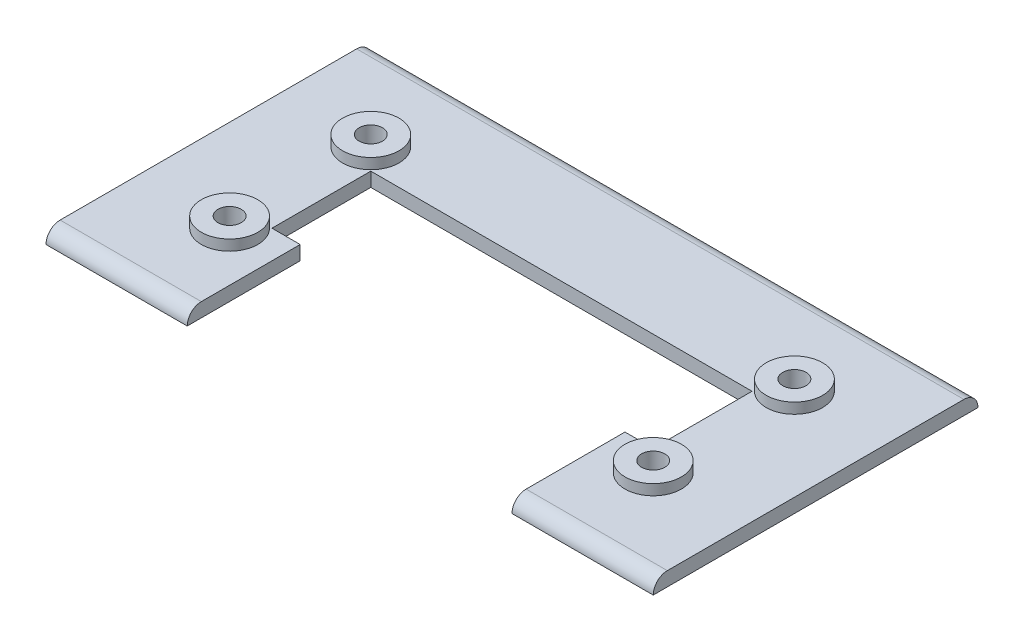
ISO-10303-21;
HEADER;
FILE_DESCRIPTION(('STEP AP214'),'2;1');
FILE_NAME('part.step','',(''),(''),'','','');
FILE_SCHEMA(('AUTOMOTIVE_DESIGN { 1 0 10303 214 1 1 1 1 }'));
ENDSEC;
DATA;
#1=APPLICATION_CONTEXT('core data for automotive mechanical design processes');
#2=APPLICATION_PROTOCOL_DEFINITION('international standard','automotive_design',2000,#1);
#3=PRODUCT_CONTEXT('',#1,'mechanical');
#4=PRODUCT('Part','Part','',(#3));
#5=PRODUCT_RELATED_PRODUCT_CATEGORY('part','',(#4));
#6=PRODUCT_DEFINITION_FORMATION('','',#4);
#7=PRODUCT_DEFINITION_CONTEXT('part definition',#1,'design');
#8=PRODUCT_DEFINITION('design','',#6,#7);
#9=PRODUCT_DEFINITION_SHAPE('','',#8);
#10=(LENGTH_UNIT() NAMED_UNIT(*) SI_UNIT(.MILLI.,.METRE.));
#11=(NAMED_UNIT(*) PLANE_ANGLE_UNIT() SI_UNIT($,.RADIAN.));
#12=(NAMED_UNIT(*) SI_UNIT($,.STERADIAN.) SOLID_ANGLE_UNIT());
#13=UNCERTAINTY_MEASURE_WITH_UNIT(LENGTH_MEASURE(1.E-05),#10,'distance_accuracy_value','');
#14=(GEOMETRIC_REPRESENTATION_CONTEXT(3) GLOBAL_UNCERTAINTY_ASSIGNED_CONTEXT((#13)) GLOBAL_UNIT_ASSIGNED_CONTEXT((#10,
#11,#12)) REPRESENTATION_CONTEXT('',''));
#15=CARTESIAN_POINT('',(0.,0.,0.));
#16=DIRECTION('',(0.,0.,1.));
#17=DIRECTION('',(1.,0.,0.));
#18=AXIS2_PLACEMENT_3D('',#15,#16,#17);
#19=CARTESIAN_POINT('',(0.,0.,21.));
#20=DIRECTION('',(-1.,0.,0.));
#21=DIRECTION('',(0.,0.,1.));
#22=AXIS2_PLACEMENT_3D('',#19,#20,#21);
#23=CYLINDRICAL_SURFACE('',#22,2.);
#24=CARTESIAN_POINT('',(-23.,0.,21.));
#25=DIRECTION('',(-1.,0.,0.));
#26=DIRECTION('',(0.,0.,1.));
#27=AXIS2_PLACEMENT_3D('',#24,#25,#26);
#28=CIRCLE('',#27,2.);
#29=CARTESIAN_POINT('',(-23.,2.,21.));
#30=VERTEX_POINT('',#29);
#31=CARTESIAN_POINT('',(-23.,0.,23.));
#32=VERTEX_POINT('',#31);
#33=EDGE_CURVE('E222',#30,#32,#28,.F.);
#34=ORIENTED_EDGE('',*,*,#33,.F.);
#35=DIRECTION('',(1.,0.,0.));
#36=VECTOR('',#35,1.);
#37=CARTESIAN_POINT('',(0.,2.,21.));
#38=LINE('',#37,#36);
#39=CARTESIAN_POINT('',(-43.,2.,21.));
#40=VERTEX_POINT('',#39);
#41=EDGE_CURVE('E380',#40,#30,#38,.T.);
#42=ORIENTED_EDGE('',*,*,#41,.F.);
#43=CARTESIAN_POINT('',(-43.,0.,21.));
#44=DIRECTION('',(1.,0.,0.));
#45=DIRECTION('',(0.,0.,-1.));
#46=AXIS2_PLACEMENT_3D('',#43,#44,#45);
#47=CIRCLE('',#46,2.);
#48=CARTESIAN_POINT('',(-43.,0.,23.));
#49=VERTEX_POINT('',#48);
#50=EDGE_CURVE('E383',#49,#40,#47,.F.);
#51=ORIENTED_EDGE('',*,*,#50,.F.);
#52=DIRECTION('',(1.,0.,0.));
#53=VECTOR('',#52,1.);
#54=CARTESIAN_POINT('',(43.,0.,23.));
#55=LINE('',#54,#53);
#56=EDGE_CURVE('E364',#49,#32,#55,.T.);
#57=ORIENTED_EDGE('',*,*,#56,.T.);
#58=EDGE_LOOP('',(#34,#42,#51,#57));
#59=FACE_BOUND('',#58,.T.);
#60=ADVANCED_FACE('F35',(#59),#23,.T.);
#61=CARTESIAN_POINT('',(27.,0.,7.));
#62=DIRECTION('',(0.,0.,1.));
#63=DIRECTION('',(1.,0.,0.));
#64=AXIS2_PLACEMENT_3D('',#61,#62,#63);
#65=PLANE('',#64);
#66=DIRECTION('',(1.,0.,0.));
#67=VECTOR('',#66,1.);
#68=CARTESIAN_POINT('',(27.,2.,7.));
#69=LINE('',#68,#67);
#70=CARTESIAN_POINT('',(-27.,2.,7.));
#71=VERTEX_POINT('',#70);
#72=CARTESIAN_POINT('',(-23.,2.,7.));
#73=VERTEX_POINT('',#72);
#74=EDGE_CURVE('E336',#71,#73,#69,.T.);
#75=ORIENTED_EDGE('',*,*,#74,.T.);
#76=DIRECTION('',(0.,1.,0.));
#77=VECTOR('',#76,1.);
#78=CARTESIAN_POINT('',(-23.,-8.,7.));
#79=LINE('',#78,#77);
#80=CARTESIAN_POINT('',(-23.,0.,7.));
#81=VERTEX_POINT('',#80);
#82=EDGE_CURVE('E212',#81,#73,#79,.T.);
#83=ORIENTED_EDGE('',*,*,#82,.F.);
#84=DIRECTION('',(1.,0.,0.));
#85=VECTOR('',#84,1.);
#86=CARTESIAN_POINT('',(27.,0.,7.));
#87=LINE('',#86,#85);
#88=CARTESIAN_POINT('',(-27.,0.,7.));
#89=VERTEX_POINT('',#88);
#90=EDGE_CURVE('E324',#89,#81,#87,.T.);
#91=ORIENTED_EDGE('',*,*,#90,.F.);
#92=DIRECTION('',(0.,1.,0.));
#93=VECTOR('',#92,1.);
#94=CARTESIAN_POINT('',(-27.,0.,7.));
#95=LINE('',#94,#93);
#96=EDGE_CURVE('E333',#89,#71,#95,.T.);
#97=ORIENTED_EDGE('',*,*,#96,.T.);
#98=EDGE_LOOP('',(#75,#83,#91,#97));
#99=FACE_BOUND('',#98,.T.);
#100=ADVANCED_FACE('F415',(#99),#65,.F.);
#101=CARTESIAN_POINT('',(-37.,0.,17.));
#102=DIRECTION('',(0.,0.707106781186549,0.707106781186546));
#103=DIRECTION('',(0.,-0.707106781186546,0.707106781186549));
#104=AXIS2_PLACEMENT_3D('',#101,#102,#103);
#105=PLANE('',#104);
#106=DIRECTION('',(1.,0.,0.));
#107=VECTOR('',#106,1.);
#108=CARTESIAN_POINT('',(-35.,0.999999999999996,16.));
#109=LINE('',#108,#107);
#110=CARTESIAN_POINT('',(-24.5,0.999999999999996,16.));
#111=VERTEX_POINT('',#110);
#112=CARTESIAN_POINT('',(-36.,0.999999999999996,16.));
#113=VERTEX_POINT('',#112);
#114=EDGE_CURVE('E194',#111,#113,#109,.F.);
#115=ORIENTED_EDGE('',*,*,#114,.F.);
#116=DIRECTION('',(0.,-0.707106781186546,0.707106781186549));
#117=VECTOR('',#116,1.);
#118=CARTESIAN_POINT('',(-24.5,0.,17.));
#119=LINE('',#118,#117);
#120=CARTESIAN_POINT('',(-24.5,0.,17.));
#121=VERTEX_POINT('',#120);
#122=EDGE_CURVE('E192',#111,#121,#119,.T.);
#123=ORIENTED_EDGE('',*,*,#122,.T.);
#124=DIRECTION('',(-1.,0.,0.));
#125=VECTOR('',#124,1.);
#126=CARTESIAN_POINT('',(-37.,0.,17.));
#127=LINE('',#126,#125);
#128=CARTESIAN_POINT('',(-37.,0.,17.));
#129=VERTEX_POINT('',#128);
#130=EDGE_CURVE('E176',#121,#129,#127,.T.);
#131=ORIENTED_EDGE('',*,*,#130,.T.);
#132=DIRECTION('',(-0.577350269189627,-0.577350269189624,0.577350269189627));
#133=VECTOR('',#132,1.);
#134=CARTESIAN_POINT('',(-37.,0.,17.));
#135=LINE('',#134,#133);
#136=EDGE_CURVE('E255',#113,#129,#135,.T.);
#137=ORIENTED_EDGE('',*,*,#136,.F.);
#138=EDGE_LOOP('',(#115,#123,#131,#137));
#139=FACE_BOUND('',#138,.T.);
#140=ADVANCED_FACE('F193',(#139),#105,.F.);
#141=CARTESIAN_POINT('',(-35.,0.,15.));
#142=DIRECTION('',(0.,0.707106781186549,-0.707106781186546));
#143=DIRECTION('',(0.,0.707106781186546,0.707106781186549));
#144=AXIS2_PLACEMENT_3D('',#141,#142,#143);
#145=PLANE('',#144);
#146=DIRECTION('',(0.,0.707106781186546,0.707106781186549));
#147=VECTOR('',#146,1.);
#148=CARTESIAN_POINT('',(-24.5,0.,15.));
#149=LINE('',#148,#147);
#150=CARTESIAN_POINT('',(-24.5,0.,15.));
#151=VERTEX_POINT('',#150);
#152=EDGE_CURVE('E50',#111,#151,#149,.F.);
#153=ORIENTED_EDGE('',*,*,#152,.F.);
#154=ORIENTED_EDGE('',*,*,#114,.T.);
#155=DIRECTION('',(0.577350269189627,-0.577350269189624,-0.577350269189627));
#156=VECTOR('',#155,1.);
#157=CARTESIAN_POINT('',(-35.,0.,15.));
#158=LINE('',#157,#156);
#159=CARTESIAN_POINT('',(-35.,0.,15.));
#160=VERTEX_POINT('',#159);
#161=EDGE_CURVE('E248',#113,#160,#158,.T.);
#162=ORIENTED_EDGE('',*,*,#161,.T.);
#163=DIRECTION('',(-1.,0.,0.));
#164=VECTOR('',#163,1.);
#165=CARTESIAN_POINT('',(-35.,0.,15.));
#166=LINE('',#165,#164);
#167=EDGE_CURVE('E55',#151,#160,#166,.T.);
#168=ORIENTED_EDGE('',*,*,#167,.F.);
#169=EDGE_LOOP('',(#153,#154,#162,#168));
#170=FACE_BOUND('',#169,.T.);
#171=ADVANCED_FACE('F458',(#170),#145,.F.);
#172=CARTESIAN_POINT('',(23.,0.,21.));
#173=DIRECTION('',(1.,0.,0.));
#174=DIRECTION('',(0.,0.,-1.));
#175=AXIS2_PLACEMENT_3D('',#172,#173,#174);
#176=CIRCLE('',#175,2.);
#177=CARTESIAN_POINT('',(23.,0.,23.));
#178=VERTEX_POINT('',#177);
#179=CARTESIAN_POINT('',(23.,2.,21.));
#180=VERTEX_POINT('',#179);
#181=EDGE_CURVE('E218',#178,#180,#176,.F.);
#182=ORIENTED_EDGE('',*,*,#181,.F.);
#183=CARTESIAN_POINT('',(43.,0.,23.));
#184=VERTEX_POINT('',#183);
#185=EDGE_CURVE('E363',#178,#184,#55,.T.);
#186=ORIENTED_EDGE('',*,*,#185,.T.);
#187=CARTESIAN_POINT('',(43.,0.,21.));
#188=DIRECTION('',(-1.,0.,0.));
#189=DIRECTION('',(0.,0.,1.));
#190=AXIS2_PLACEMENT_3D('',#187,#188,#189);
#191=CIRCLE('',#190,2.);
#192=CARTESIAN_POINT('',(43.,2.,21.));
#193=VERTEX_POINT('',#192);
#194=EDGE_CURVE('E43',#193,#184,#191,.F.);
#195=ORIENTED_EDGE('',*,*,#194,.F.);
#196=EDGE_CURVE('E379',#180,#193,#38,.T.);
#197=ORIENTED_EDGE('',*,*,#196,.F.);
#198=EDGE_LOOP('',(#182,#186,#195,#197));
#199=FACE_BOUND('',#198,.T.);
#200=ADVANCED_FACE('F37',(#199),#23,.T.);
#201=CARTESIAN_POINT('',(43.,0.,-21.));
#202=DIRECTION('',(-1.,0.,0.));
#203=DIRECTION('',(0.,0.,1.));
#204=AXIS2_PLACEMENT_3D('',#201,#202,#203);
#205=CYLINDRICAL_SURFACE('',#204,2.);
#206=DIRECTION('',(-1.,0.,0.));
#207=VECTOR('',#206,1.);
#208=CARTESIAN_POINT('',(43.,0.,-23.));
#209=LINE('',#208,#207);
#210=CARTESIAN_POINT('',(43.,0.,-23.));
#211=VERTEX_POINT('',#210);
#212=CARTESIAN_POINT('',(-43.,0.,-23.));
#213=VERTEX_POINT('',#212);
#214=EDGE_CURVE('E358',#211,#213,#209,.T.);
#215=ORIENTED_EDGE('',*,*,#214,.T.);
#216=CARTESIAN_POINT('',(-43.,0.,-21.));
#217=DIRECTION('',(1.,0.,0.));
#218=DIRECTION('',(0.,0.,-1.));
#219=AXIS2_PLACEMENT_3D('',#216,#217,#218);
#220=CIRCLE('',#219,2.);
#221=CARTESIAN_POINT('',(-43.,2.,-21.));
#222=VERTEX_POINT('',#221);
#223=EDGE_CURVE('E374',#222,#213,#220,.F.);
#224=ORIENTED_EDGE('',*,*,#223,.F.);
#225=DIRECTION('',(1.,0.,0.));
#226=VECTOR('',#225,1.);
#227=CARTESIAN_POINT('',(43.,2.,-21.));
#228=LINE('',#227,#226);
#229=CARTESIAN_POINT('',(43.,2.,-21.));
#230=VERTEX_POINT('',#229);
#231=EDGE_CURVE('E360',#230,#222,#228,.F.);
#232=ORIENTED_EDGE('',*,*,#231,.F.);
#233=CARTESIAN_POINT('',(43.,0.,-21.));
#234=DIRECTION('',(-1.,0.,0.));
#235=DIRECTION('',(0.,0.,1.));
#236=AXIS2_PLACEMENT_3D('',#233,#234,#235);
#237=CIRCLE('',#236,2.);
#238=EDGE_CURVE('E376',#211,#230,#237,.F.);
#239=ORIENTED_EDGE('',*,*,#238,.F.);
#240=EDGE_LOOP('',(#215,#224,#232,#239));
#241=FACE_BOUND('',#240,.T.);
#242=ADVANCED_FACE('F398',(#241),#205,.T.);
#243=CARTESIAN_POINT('',(0.,2.,0.));
#244=DIRECTION('',(0.,1.,0.));
#245=DIRECTION('',(0.,0.,1.));
#246=AXIS2_PLACEMENT_3D('',#243,#244,#245);
#247=PLANE('',#246);
#248=ORIENTED_EDGE('',*,*,#41,.T.);
#249=DIRECTION('',(0.,0.,1.));
#250=VECTOR('',#249,1.);
#251=CARTESIAN_POINT('',(-23.,2.,7.));
#252=LINE('',#251,#250);
#253=EDGE_CURVE('E207',#73,#30,#252,.T.);
#254=ORIENTED_EDGE('',*,*,#253,.F.);
#255=ORIENTED_EDGE('',*,*,#74,.F.);
#256=DIRECTION('',(0.,0.,1.));
#257=VECTOR('',#256,1.);
#258=CARTESIAN_POINT('',(-27.,2.,7.));
#259=LINE('',#258,#257);
#260=CARTESIAN_POINT('',(-27.,2.,-7.));
#261=VERTEX_POINT('',#260);
#262=EDGE_CURVE('E316',#261,#71,#259,.T.);
#263=ORIENTED_EDGE('',*,*,#262,.F.);
#264=DIRECTION('',(-1.,0.,0.));
#265=VECTOR('',#264,1.);
#266=CARTESIAN_POINT('',(27.,2.,-7.));
#267=LINE('',#266,#265);
#268=CARTESIAN_POINT('',(27.,2.,-7.));
#269=VERTEX_POINT('',#268);
#270=EDGE_CURVE('E323',#269,#261,#267,.T.);
#271=ORIENTED_EDGE('',*,*,#270,.F.);
#272=DIRECTION('',(0.,0.,-1.));
#273=VECTOR('',#272,1.);
#274=CARTESIAN_POINT('',(27.,2.,7.));
#275=LINE('',#274,#273);
#276=CARTESIAN_POINT('',(27.,2.,7.));
#277=VERTEX_POINT('',#276);
#278=EDGE_CURVE('E339',#277,#269,#275,.T.);
#279=ORIENTED_EDGE('',*,*,#278,.F.);
#280=CARTESIAN_POINT('',(23.,2.,7.));
#281=VERTEX_POINT('',#280);
#282=EDGE_CURVE('E335',#281,#277,#69,.T.);
#283=ORIENTED_EDGE('',*,*,#282,.F.);
#284=DIRECTION('',(0.,0.,-1.));
#285=VECTOR('',#284,1.);
#286=CARTESIAN_POINT('',(23.,2.,7.));
#287=LINE('',#286,#285);
#288=EDGE_CURVE('E209',#180,#281,#287,.T.);
#289=ORIENTED_EDGE('',*,*,#288,.F.);
#290=ORIENTED_EDGE('',*,*,#196,.T.);
#291=DIRECTION('',(0.,0.,-1.));
#292=VECTOR('',#291,1.);
#293=CARTESIAN_POINT('',(43.,2.,23.));
#294=LINE('',#293,#292);
#295=EDGE_CURVE('E357',#193,#230,#294,.T.);
#296=ORIENTED_EDGE('',*,*,#295,.T.);
#297=ORIENTED_EDGE('',*,*,#231,.T.);
#298=DIRECTION('',(0.,0.,1.));
#299=VECTOR('',#298,1.);
#300=CARTESIAN_POINT('',(-43.,2.,23.));
#301=LINE('',#300,#299);
#302=EDGE_CURVE('E354',#222,#40,#301,.T.);
#303=ORIENTED_EDGE('',*,*,#302,.T.);
#304=EDGE_LOOP('',(#248,#254,#255,#263,#271,#279,#283,#289,#290,#296,#297,#303));
#305=FACE_BOUND('',#304,.T.);
#306=CARTESIAN_POINT('',(30.,2.,10.));
#307=DIRECTION('',(0.,1.,0.));
#308=DIRECTION('',(0.,0.,1.));
#309=AXIS2_PLACEMENT_3D('',#306,#307,#308);
#310=CIRCLE('',#309,4.00000000000001);
#311=CARTESIAN_POINT('',(30.,2.,14.));
#312=VERTEX_POINT('',#311);
#313=EDGE_CURVE('E298',#312,#312,#310,.T.);
#314=ORIENTED_EDGE('',*,*,#313,.F.);
#315=EDGE_LOOP('',(#314));
#316=FACE_BOUND('',#315,.T.);
#317=CARTESIAN_POINT('',(-30.,2.,-10.));
#318=DIRECTION('',(0.,1.,0.));
#319=DIRECTION('',(0.,0.,1.));
#320=AXIS2_PLACEMENT_3D('',#317,#318,#319);
#321=CIRCLE('',#320,4.);
#322=CARTESIAN_POINT('',(-30.,2.,-6.));
#323=VERTEX_POINT('',#322);
#324=EDGE_CURVE('E310',#323,#323,#321,.T.);
#325=ORIENTED_EDGE('',*,*,#324,.F.);
#326=EDGE_LOOP('',(#325));
#327=FACE_BOUND('',#326,.T.);
#328=CARTESIAN_POINT('',(-30.,2.,10.));
#329=DIRECTION('',(0.,1.,0.));
#330=DIRECTION('',(0.,0.,-1.));
#331=AXIS2_PLACEMENT_3D('',#328,#329,#330);
#332=CIRCLE('',#331,4.00000000000001);
#333=CARTESIAN_POINT('',(-30.,2.,6.00000000000001));
#334=VERTEX_POINT('',#333);
#335=EDGE_CURVE('E304',#334,#334,#332,.T.);
#336=ORIENTED_EDGE('',*,*,#335,.F.);
#337=EDGE_LOOP('',(#336));
#338=FACE_BOUND('',#337,.T.);
#339=CARTESIAN_POINT('',(30.,2.,-10.));
#340=DIRECTION('',(0.,1.,0.));
#341=DIRECTION('',(0.,0.,-1.));
#342=AXIS2_PLACEMENT_3D('',#339,#340,#341);
#343=CIRCLE('',#342,4.00000000000001);
#344=CARTESIAN_POINT('',(30.,2.,-14.));
#345=VERTEX_POINT('',#344);
#346=EDGE_CURVE('E294',#345,#345,#343,.T.);
#347=ORIENTED_EDGE('',*,*,#346,.F.);
#348=EDGE_LOOP('',(#347));
#349=FACE_BOUND('',#348,.T.);
#350=ADVANCED_FACE('F402',(#305,#316,#327,#338,#349),#247,.T.);
#351=CARTESIAN_POINT('',(-43.,2.,23.));
#352=DIRECTION('',(1.,0.,0.));
#353=DIRECTION('',(0.,0.,-1.));
#354=AXIS2_PLACEMENT_3D('',#351,#352,#353);
#355=PLANE('',#354);
#356=DIRECTION('',(0.,0.,1.));
#357=VECTOR('',#356,1.);
#358=CARTESIAN_POINT('',(-43.,0.,23.));
#359=LINE('',#358,#357);
#360=EDGE_CURVE('E346',#213,#49,#359,.T.);
#361=ORIENTED_EDGE('',*,*,#360,.T.);
#362=ORIENTED_EDGE('',*,*,#50,.T.);
#363=ORIENTED_EDGE('',*,*,#302,.F.);
#364=ORIENTED_EDGE('',*,*,#223,.T.);
#365=EDGE_LOOP('',(#361,#362,#363,#364));
#366=FACE_BOUND('',#365,.T.);
#367=ADVANCED_FACE('F405',(#366),#355,.F.);
#368=CARTESIAN_POINT('',(43.,2.,23.));
#369=DIRECTION('',(-1.,0.,0.));
#370=DIRECTION('',(0.,0.,1.));
#371=AXIS2_PLACEMENT_3D('',#368,#369,#370);
#372=PLANE('',#371);
#373=ORIENTED_EDGE('',*,*,#295,.F.);
#374=ORIENTED_EDGE('',*,*,#194,.T.);
#375=DIRECTION('',(0.,0.,-1.));
#376=VECTOR('',#375,1.);
#377=CARTESIAN_POINT('',(43.,0.,23.));
#378=LINE('',#377,#376);
#379=EDGE_CURVE('E367',#184,#211,#378,.T.);
#380=ORIENTED_EDGE('',*,*,#379,.T.);
#381=ORIENTED_EDGE('',*,*,#238,.T.);
#382=EDGE_LOOP('',(#373,#374,#380,#381));
#383=FACE_BOUND('',#382,.T.);
#384=ADVANCED_FACE('F389',(#383),#372,.F.);
#385=CARTESIAN_POINT('',(0.,0.,0.));
#386=DIRECTION('',(0.,1.,0.));
#387=DIRECTION('',(0.,0.,1.));
#388=AXIS2_PLACEMENT_3D('',#385,#386,#387);
#389=PLANE('',#388);
#390=DIRECTION('',(0.,0.,-1.));
#391=VECTOR('',#390,1.);
#392=CARTESIAN_POINT('',(-24.5,0.,15.));
#393=LINE('',#392,#391);
#394=EDGE_CURVE('E181',#121,#151,#393,.T.);
#395=ORIENTED_EDGE('',*,*,#394,.T.);
#396=ORIENTED_EDGE('',*,*,#167,.T.);
#397=DIRECTION('',(0.,0.,-1.));
#398=VECTOR('',#397,1.);
#399=CARTESIAN_POINT('',(-35.,0.,-15.));
#400=LINE('',#399,#398);
#401=CARTESIAN_POINT('',(-35.,0.,-15.));
#402=VERTEX_POINT('',#401);
#403=EDGE_CURVE('E234',#160,#402,#400,.T.);
#404=ORIENTED_EDGE('',*,*,#403,.T.);
#405=DIRECTION('',(1.,0.,0.));
#406=VECTOR('',#405,1.);
#407=CARTESIAN_POINT('',(35.,0.,-15.));
#408=LINE('',#407,#406);
#409=CARTESIAN_POINT('',(35.,0.,-15.));
#410=VERTEX_POINT('',#409);
#411=EDGE_CURVE('E225',#402,#410,#408,.T.);
#412=ORIENTED_EDGE('',*,*,#411,.T.);
#413=DIRECTION('',(0.,0.,1.));
#414=VECTOR('',#413,1.);
#415=CARTESIAN_POINT('',(35.,0.,15.));
#416=LINE('',#415,#414);
#417=CARTESIAN_POINT('',(35.,0.,15.));
#418=VERTEX_POINT('',#417);
#419=EDGE_CURVE('E228',#410,#418,#416,.T.);
#420=ORIENTED_EDGE('',*,*,#419,.T.);
#421=CARTESIAN_POINT('',(24.5,0.,15.));
#422=VERTEX_POINT('',#421);
#423=EDGE_CURVE('E231',#418,#422,#166,.T.);
#424=ORIENTED_EDGE('',*,*,#423,.T.);
#425=DIRECTION('',(0.,0.,1.));
#426=VECTOR('',#425,1.);
#427=CARTESIAN_POINT('',(24.5,0.,15.));
#428=LINE('',#427,#426);
#429=CARTESIAN_POINT('',(24.5,0.,17.));
#430=VERTEX_POINT('',#429);
#431=EDGE_CURVE('E196',#422,#430,#428,.T.);
#432=ORIENTED_EDGE('',*,*,#431,.T.);
#433=CARTESIAN_POINT('',(37.,0.,17.));
#434=VERTEX_POINT('',#433);
#435=EDGE_CURVE('E188',#434,#430,#127,.T.);
#436=ORIENTED_EDGE('',*,*,#435,.F.);
#437=DIRECTION('',(0.,0.,1.));
#438=VECTOR('',#437,1.);
#439=CARTESIAN_POINT('',(37.,0.,17.));
#440=LINE('',#439,#438);
#441=CARTESIAN_POINT('',(37.,0.,-17.));
#442=VERTEX_POINT('',#441);
#443=EDGE_CURVE('E189',#442,#434,#440,.T.);
#444=ORIENTED_EDGE('',*,*,#443,.F.);
#445=DIRECTION('',(1.,0.,0.));
#446=VECTOR('',#445,1.);
#447=CARTESIAN_POINT('',(37.,0.,-17.));
#448=LINE('',#447,#446);
#449=CARTESIAN_POINT('',(-37.,0.,-17.));
#450=VERTEX_POINT('',#449);
#451=EDGE_CURVE('E238',#450,#442,#448,.T.);
#452=ORIENTED_EDGE('',*,*,#451,.F.);
#453=DIRECTION('',(0.,0.,-1.));
#454=VECTOR('',#453,1.);
#455=CARTESIAN_POINT('',(-37.,0.,-17.));
#456=LINE('',#455,#454);
#457=EDGE_CURVE('E184',#129,#450,#456,.T.);
#458=ORIENTED_EDGE('',*,*,#457,.F.);
#459=ORIENTED_EDGE('',*,*,#130,.F.);
#460=EDGE_LOOP('',(#395,#396,#404,#412,#420,#424,#432,#436,#444,#452,#458,#459));
#461=FACE_BOUND('',#460,.T.);
#462=DIRECTION('',(0.,0.,1.));
#463=VECTOR('',#462,1.);
#464=CARTESIAN_POINT('',(-23.,0.,0.));
#465=LINE('',#464,#463);
#466=EDGE_CURVE('E220',#81,#32,#465,.T.);
#467=ORIENTED_EDGE('',*,*,#466,.T.);
#468=ORIENTED_EDGE('',*,*,#56,.F.);
#469=ORIENTED_EDGE('',*,*,#360,.F.);
#470=ORIENTED_EDGE('',*,*,#214,.F.);
#471=ORIENTED_EDGE('',*,*,#379,.F.);
#472=ORIENTED_EDGE('',*,*,#185,.F.);
#473=DIRECTION('',(0.,0.,-1.));
#474=VECTOR('',#473,1.);
#475=CARTESIAN_POINT('',(23.,0.,0.));
#476=LINE('',#475,#474);
#477=CARTESIAN_POINT('',(23.,0.,7.));
#478=VERTEX_POINT('',#477);
#479=EDGE_CURVE('E214',#178,#478,#476,.T.);
#480=ORIENTED_EDGE('',*,*,#479,.T.);
#481=CARTESIAN_POINT('',(27.,0.,7.));
#482=VERTEX_POINT('',#481);
#483=EDGE_CURVE('E322',#478,#482,#87,.T.);
#484=ORIENTED_EDGE('',*,*,#483,.T.);
#485=DIRECTION('',(0.,0.,-1.));
#486=VECTOR('',#485,1.);
#487=CARTESIAN_POINT('',(27.,0.,7.));
#488=LINE('',#487,#486);
#489=CARTESIAN_POINT('',(27.,0.,-7.));
#490=VERTEX_POINT('',#489);
#491=EDGE_CURVE('E327',#482,#490,#488,.T.);
#492=ORIENTED_EDGE('',*,*,#491,.T.);
#493=DIRECTION('',(-1.,0.,0.));
#494=VECTOR('',#493,1.);
#495=CARTESIAN_POINT('',(27.,0.,-7.));
#496=LINE('',#495,#494);
#497=CARTESIAN_POINT('',(-27.,0.,-7.));
#498=VERTEX_POINT('',#497);
#499=EDGE_CURVE('E330',#490,#498,#496,.T.);
#500=ORIENTED_EDGE('',*,*,#499,.T.);
#501=DIRECTION('',(0.,0.,1.));
#502=VECTOR('',#501,1.);
#503=CARTESIAN_POINT('',(-27.,0.,7.));
#504=LINE('',#503,#502);
#505=EDGE_CURVE('E319',#498,#89,#504,.T.);
#506=ORIENTED_EDGE('',*,*,#505,.T.);
#507=ORIENTED_EDGE('',*,*,#90,.T.);
#508=EDGE_LOOP('',(#467,#468,#469,#470,#471,#472,#480,#484,#492,#500,#506,#507));
#509=FACE_BOUND('',#508,.T.);
#510=CARTESIAN_POINT('',(-30.,0.,-10.));
#511=DIRECTION('',(0.,1.,0.));
#512=DIRECTION('',(0.,0.,1.));
#513=AXIS2_PLACEMENT_3D('',#510,#511,#512);
#514=CIRCLE('',#513,1.65);
#515=CARTESIAN_POINT('',(-30.,0.,-8.35000000000001));
#516=VERTEX_POINT('',#515);
#517=EDGE_CURVE('E291',#516,#516,#514,.T.);
#518=ORIENTED_EDGE('',*,*,#517,.T.);
#519=EDGE_LOOP('',(#518));
#520=FACE_BOUND('',#519,.T.);
#521=CARTESIAN_POINT('',(30.,0.,-10.));
#522=DIRECTION('',(0.,1.,0.));
#523=DIRECTION('',(0.,0.,1.));
#524=AXIS2_PLACEMENT_3D('',#521,#522,#523);
#525=CIRCLE('',#524,1.65);
#526=CARTESIAN_POINT('',(30.,0.,-8.35000000000002));
#527=VERTEX_POINT('',#526);
#528=EDGE_CURVE('E285',#527,#527,#525,.T.);
#529=ORIENTED_EDGE('',*,*,#528,.T.);
#530=EDGE_LOOP('',(#529));
#531=FACE_BOUND('',#530,.T.);
#532=CARTESIAN_POINT('',(30.,0.,10.));
#533=DIRECTION('',(0.,1.,0.));
#534=DIRECTION('',(0.,0.,1.));
#535=AXIS2_PLACEMENT_3D('',#532,#533,#534);
#536=CIRCLE('',#535,1.65);
#537=CARTESIAN_POINT('',(30.,0.,11.65));
#538=VERTEX_POINT('',#537);
#539=EDGE_CURVE('E279',#538,#538,#536,.T.);
#540=ORIENTED_EDGE('',*,*,#539,.T.);
#541=EDGE_LOOP('',(#540));
#542=FACE_BOUND('',#541,.T.);
#543=CARTESIAN_POINT('',(-30.,0.,10.));
#544=DIRECTION('',(0.,1.,0.));
#545=DIRECTION('',(0.,0.,1.));
#546=AXIS2_PLACEMENT_3D('',#543,#544,#545);
#547=CIRCLE('',#546,1.65);
#548=CARTESIAN_POINT('',(-30.,0.,11.65));
#549=VERTEX_POINT('',#548);
#550=EDGE_CURVE('E273',#549,#549,#547,.T.);
#551=ORIENTED_EDGE('',*,*,#550,.T.);
#552=EDGE_LOOP('',(#551));
#553=FACE_BOUND('',#552,.T.);
#554=ADVANCED_FACE('F178',(#461,#509,#520,#531,#542,#553),#389,.F.);
#555=CARTESIAN_POINT('',(-27.,0.,7.));
#556=DIRECTION('',(-1.,0.,0.));
#557=DIRECTION('',(0.,0.,1.));
#558=AXIS2_PLACEMENT_3D('',#555,#556,#557);
#559=PLANE('',#558);
#560=ORIENTED_EDGE('',*,*,#262,.T.);
#561=ORIENTED_EDGE('',*,*,#96,.F.);
#562=ORIENTED_EDGE('',*,*,#505,.F.);
#563=DIRECTION('',(0.,1.,0.));
#564=VECTOR('',#563,1.);
#565=CARTESIAN_POINT('',(-27.,0.,-7.));
#566=LINE('',#565,#564);
#567=EDGE_CURVE('E344',#498,#261,#566,.T.);
#568=ORIENTED_EDGE('',*,*,#567,.T.);
#569=EDGE_LOOP('',(#560,#561,#562,#568));
#570=FACE_BOUND('',#569,.T.);
#571=ADVANCED_FACE('F419',(#570),#559,.F.);
#572=CARTESIAN_POINT('',(27.,0.,-7.));
#573=DIRECTION('',(0.,0.,-1.));
#574=DIRECTION('',(-1.,0.,0.));
#575=AXIS2_PLACEMENT_3D('',#572,#573,#574);
#576=PLANE('',#575);
#577=ORIENTED_EDGE('',*,*,#270,.T.);
#578=ORIENTED_EDGE('',*,*,#567,.F.);
#579=ORIENTED_EDGE('',*,*,#499,.F.);
#580=DIRECTION('',(0.,1.,0.));
#581=VECTOR('',#580,1.);
#582=CARTESIAN_POINT('',(27.,0.,-7.));
#583=LINE('',#582,#581);
#584=EDGE_CURVE('E347',#490,#269,#583,.T.);
#585=ORIENTED_EDGE('',*,*,#584,.T.);
#586=EDGE_LOOP('',(#577,#578,#579,#585));
#587=FACE_BOUND('',#586,.T.);
#588=ADVANCED_FACE('F424',(#587),#576,.F.);
#589=CARTESIAN_POINT('',(27.,0.,7.));
#590=DIRECTION('',(1.,0.,0.));
#591=DIRECTION('',(0.,0.,-1.));
#592=AXIS2_PLACEMENT_3D('',#589,#590,#591);
#593=PLANE('',#592);
#594=ORIENTED_EDGE('',*,*,#278,.T.);
#595=ORIENTED_EDGE('',*,*,#584,.F.);
#596=ORIENTED_EDGE('',*,*,#491,.F.);
#597=DIRECTION('',(0.,1.,0.));
#598=VECTOR('',#597,1.);
#599=CARTESIAN_POINT('',(27.,0.,7.));
#600=LINE('',#599,#598);
#601=EDGE_CURVE('E349',#482,#277,#600,.T.);
#602=ORIENTED_EDGE('',*,*,#601,.T.);
#603=EDGE_LOOP('',(#594,#595,#596,#602));
#604=FACE_BOUND('',#603,.T.);
#605=ADVANCED_FACE('F428',(#604),#593,.F.);
#606=ORIENTED_EDGE('',*,*,#483,.F.);
#607=DIRECTION('',(0.,1.,0.));
#608=VECTOR('',#607,1.);
#609=CARTESIAN_POINT('',(23.,-8.,7.));
#610=LINE('',#609,#608);
#611=EDGE_CURVE('E211',#478,#281,#610,.T.);
#612=ORIENTED_EDGE('',*,*,#611,.T.);
#613=ORIENTED_EDGE('',*,*,#282,.T.);
#614=ORIENTED_EDGE('',*,*,#601,.F.);
#615=EDGE_LOOP('',(#606,#612,#613,#614));
#616=FACE_BOUND('',#615,.T.);
#617=ADVANCED_FACE('F432',(#616),#65,.F.);
#618=CARTESIAN_POINT('',(-30.,3.5,-10.));
#619=DIRECTION('',(0.,-1.,0.));
#620=DIRECTION('',(0.,0.,-1.));
#621=AXIS2_PLACEMENT_3D('',#618,#619,#620);
#622=CYLINDRICAL_SURFACE('',#621,4.);
#623=CARTESIAN_POINT('',(-30.,3.5,-10.));
#624=DIRECTION('',(0.,1.,0.));
#625=DIRECTION('',(0.,0.,1.));
#626=AXIS2_PLACEMENT_3D('',#623,#624,#625);
#627=CIRCLE('',#626,4.);
#628=CARTESIAN_POINT('',(-30.,3.5,-6.));
#629=VERTEX_POINT('',#628);
#630=EDGE_CURVE('E313',#629,#629,#627,.T.);
#631=ORIENTED_EDGE('',*,*,#630,.F.);
#632=EDGE_LOOP('',(#631));
#633=FACE_BOUND('',#632,.T.);
#634=ORIENTED_EDGE('',*,*,#324,.T.);
#635=EDGE_LOOP('',(#634));
#636=FACE_BOUND('',#635,.T.);
#637=ADVANCED_FACE('F561',(#633,#636),#622,.T.);
#638=CARTESIAN_POINT('',(-30.,3.5,-10.));
#639=DIRECTION('',(0.,1.,0.));
#640=DIRECTION('',(0.,0.,1.));
#641=AXIS2_PLACEMENT_3D('',#638,#639,#640);
#642=PLANE('',#641);
#643=CARTESIAN_POINT('',(-30.,3.5,-10.));
#644=DIRECTION('',(0.,-1.,0.));
#645=DIRECTION('',(0.,0.,-1.));
#646=AXIS2_PLACEMENT_3D('',#643,#644,#645);
#647=CIRCLE('',#646,1.65);
#648=CARTESIAN_POINT('',(-30.,3.5,-11.65));
#649=VERTEX_POINT('',#648);
#650=EDGE_CURVE('E288',#649,#649,#647,.T.);
#651=ORIENTED_EDGE('',*,*,#650,.T.);
#652=EDGE_LOOP('',(#651));
#653=FACE_BOUND('',#652,.T.);
#654=ORIENTED_EDGE('',*,*,#630,.T.);
#655=EDGE_LOOP('',(#654));
#656=FACE_BOUND('',#655,.T.);
#657=ADVANCED_FACE('F557',(#653,#656),#642,.T.);
#658=CARTESIAN_POINT('',(-30.,3.5,10.));
#659=DIRECTION('',(0.,-1.,0.));
#660=DIRECTION('',(0.,0.,-1.));
#661=AXIS2_PLACEMENT_3D('',#658,#659,#660);
#662=CYLINDRICAL_SURFACE('',#661,4.00000000000001);
#663=CARTESIAN_POINT('',(-30.,3.5,10.));
#664=DIRECTION('',(0.,1.,0.));
#665=DIRECTION('',(0.,0.,-1.));
#666=AXIS2_PLACEMENT_3D('',#663,#664,#665);
#667=CIRCLE('',#666,4.00000000000001);
#668=CARTESIAN_POINT('',(-30.,3.5,6.00000000000001));
#669=VERTEX_POINT('',#668);
#670=EDGE_CURVE('E307',#669,#669,#667,.T.);
#671=ORIENTED_EDGE('',*,*,#670,.F.);
#672=EDGE_LOOP('',(#671));
#673=FACE_BOUND('',#672,.T.);
#674=ORIENTED_EDGE('',*,*,#335,.T.);
#675=EDGE_LOOP('',(#674));
#676=FACE_BOUND('',#675,.T.);
#677=ADVANCED_FACE('F553',(#673,#676),#662,.T.);
#678=CARTESIAN_POINT('',(-30.,3.5,10.));
#679=DIRECTION('',(0.,-1.,0.));
#680=DIRECTION('',(0.,0.,-1.));
#681=AXIS2_PLACEMENT_3D('',#678,#679,#680);
#682=PLANE('',#681);
#683=CARTESIAN_POINT('',(-30.,3.5,10.));
#684=DIRECTION('',(0.,-1.,0.));
#685=DIRECTION('',(0.,0.,-1.));
#686=AXIS2_PLACEMENT_3D('',#683,#684,#685);
#687=CIRCLE('',#686,1.65);
#688=CARTESIAN_POINT('',(-30.,3.5,8.35000000000001));
#689=VERTEX_POINT('',#688);
#690=EDGE_CURVE('E270',#689,#689,#687,.T.);
#691=ORIENTED_EDGE('',*,*,#690,.T.);
#692=EDGE_LOOP('',(#691));
#693=FACE_BOUND('',#692,.T.);
#694=ORIENTED_EDGE('',*,*,#670,.T.);
#695=EDGE_LOOP('',(#694));
#696=FACE_BOUND('',#695,.T.);
#697=ADVANCED_FACE('F549',(#693,#696),#682,.F.);
#698=CARTESIAN_POINT('',(30.,3.5,10.));
#699=DIRECTION('',(0.,-1.,0.));
#700=DIRECTION('',(0.,0.,-1.));
#701=AXIS2_PLACEMENT_3D('',#698,#699,#700);
#702=CYLINDRICAL_SURFACE('',#701,4.00000000000001);
#703=CARTESIAN_POINT('',(30.,3.5,10.));
#704=DIRECTION('',(0.,1.,0.));
#705=DIRECTION('',(0.,0.,1.));
#706=AXIS2_PLACEMENT_3D('',#703,#704,#705);
#707=CIRCLE('',#706,4.00000000000001);
#708=CARTESIAN_POINT('',(30.,3.5,14.));
#709=VERTEX_POINT('',#708);
#710=EDGE_CURVE('E301',#709,#709,#707,.T.);
#711=ORIENTED_EDGE('',*,*,#710,.F.);
#712=EDGE_LOOP('',(#711));
#713=FACE_BOUND('',#712,.T.);
#714=ORIENTED_EDGE('',*,*,#313,.T.);
#715=EDGE_LOOP('',(#714));
#716=FACE_BOUND('',#715,.T.);
#717=ADVANCED_FACE('F545',(#713,#716),#702,.T.);
#718=CARTESIAN_POINT('',(30.,3.5,10.));
#719=DIRECTION('',(0.,1.,0.));
#720=DIRECTION('',(0.,0.,1.));
#721=AXIS2_PLACEMENT_3D('',#718,#719,#720);
#722=PLANE('',#721);
#723=CARTESIAN_POINT('',(30.,3.5,10.));
#724=DIRECTION('',(0.,-1.,0.));
#725=DIRECTION('',(0.,0.,-1.));
#726=AXIS2_PLACEMENT_3D('',#723,#724,#725);
#727=CIRCLE('',#726,1.65);
#728=CARTESIAN_POINT('',(30.,3.5,8.35000000000001));
#729=VERTEX_POINT('',#728);
#730=EDGE_CURVE('E276',#729,#729,#727,.T.);
#731=ORIENTED_EDGE('',*,*,#730,.T.);
#732=EDGE_LOOP('',(#731));
#733=FACE_BOUND('',#732,.T.);
#734=ORIENTED_EDGE('',*,*,#710,.T.);
#735=EDGE_LOOP('',(#734));
#736=FACE_BOUND('',#735,.T.);
#737=ADVANCED_FACE('F541',(#733,#736),#722,.T.);
#738=CARTESIAN_POINT('',(30.,3.5,-10.));
#739=DIRECTION('',(0.,-1.,0.));
#740=DIRECTION('',(0.,0.,-1.));
#741=AXIS2_PLACEMENT_3D('',#738,#739,#740);
#742=CYLINDRICAL_SURFACE('',#741,4.00000000000001);
#743=CARTESIAN_POINT('',(30.,3.5,-10.));
#744=DIRECTION('',(0.,1.,0.));
#745=DIRECTION('',(0.,0.,-1.));
#746=AXIS2_PLACEMENT_3D('',#743,#744,#745);
#747=CIRCLE('',#746,4.00000000000001);
#748=CARTESIAN_POINT('',(30.,3.5,-14.));
#749=VERTEX_POINT('',#748);
#750=EDGE_CURVE('E295',#749,#749,#747,.T.);
#751=ORIENTED_EDGE('',*,*,#750,.F.);
#752=EDGE_LOOP('',(#751));
#753=FACE_BOUND('',#752,.T.);
#754=ORIENTED_EDGE('',*,*,#346,.T.);
#755=EDGE_LOOP('',(#754));
#756=FACE_BOUND('',#755,.T.);
#757=ADVANCED_FACE('F537',(#753,#756),#742,.T.);
#758=CARTESIAN_POINT('',(30.,3.5,-10.));
#759=DIRECTION('',(0.,-1.,0.));
#760=DIRECTION('',(0.,0.,-1.));
#761=AXIS2_PLACEMENT_3D('',#758,#759,#760);
#762=PLANE('',#761);
#763=CARTESIAN_POINT('',(30.,3.5,-10.));
#764=DIRECTION('',(0.,-1.,0.));
#765=DIRECTION('',(0.,0.,-1.));
#766=AXIS2_PLACEMENT_3D('',#763,#764,#765);
#767=CIRCLE('',#766,1.65);
#768=CARTESIAN_POINT('',(30.,3.5,-11.65));
#769=VERTEX_POINT('',#768);
#770=EDGE_CURVE('E282',#769,#769,#767,.T.);
#771=ORIENTED_EDGE('',*,*,#770,.T.);
#772=EDGE_LOOP('',(#771));
#773=FACE_BOUND('',#772,.T.);
#774=ORIENTED_EDGE('',*,*,#750,.T.);
#775=EDGE_LOOP('',(#774));
#776=FACE_BOUND('',#775,.T.);
#777=ADVANCED_FACE('F533',(#773,#776),#762,.F.);
#778=CARTESIAN_POINT('',(-30.,-8.,-10.));
#779=DIRECTION('',(0.,1.,0.));
#780=DIRECTION('',(0.,0.,1.));
#781=AXIS2_PLACEMENT_3D('',#778,#779,#780);
#782=CYLINDRICAL_SURFACE('',#781,1.65);
#783=ORIENTED_EDGE('',*,*,#650,.F.);
#784=EDGE_LOOP('',(#783));
#785=FACE_BOUND('',#784,.T.);
#786=ORIENTED_EDGE('',*,*,#517,.F.);
#787=EDGE_LOOP('',(#786));
#788=FACE_BOUND('',#787,.T.);
#789=ADVANCED_FACE('F529',(#785,#788),#782,.F.);
#790=CARTESIAN_POINT('',(30.,-8.,-10.));
#791=DIRECTION('',(0.,1.,0.));
#792=DIRECTION('',(0.,0.,1.));
#793=AXIS2_PLACEMENT_3D('',#790,#791,#792);
#794=CYLINDRICAL_SURFACE('',#793,1.65);
#795=ORIENTED_EDGE('',*,*,#770,.F.);
#796=EDGE_LOOP('',(#795));
#797=FACE_BOUND('',#796,.T.);
#798=ORIENTED_EDGE('',*,*,#528,.F.);
#799=EDGE_LOOP('',(#798));
#800=FACE_BOUND('',#799,.T.);
#801=ADVANCED_FACE('F525',(#797,#800),#794,.F.);
#802=CARTESIAN_POINT('',(30.,-8.,10.));
#803=DIRECTION('',(0.,1.,0.));
#804=DIRECTION('',(0.,0.,1.));
#805=AXIS2_PLACEMENT_3D('',#802,#803,#804);
#806=CYLINDRICAL_SURFACE('',#805,1.65);
#807=ORIENTED_EDGE('',*,*,#730,.F.);
#808=EDGE_LOOP('',(#807));
#809=FACE_BOUND('',#808,.T.);
#810=ORIENTED_EDGE('',*,*,#539,.F.);
#811=EDGE_LOOP('',(#810));
#812=FACE_BOUND('',#811,.T.);
#813=ADVANCED_FACE('F521',(#809,#812),#806,.F.);
#814=CARTESIAN_POINT('',(-30.,-8.,10.));
#815=DIRECTION('',(0.,1.,0.));
#816=DIRECTION('',(0.,0.,1.));
#817=AXIS2_PLACEMENT_3D('',#814,#815,#816);
#818=CYLINDRICAL_SURFACE('',#817,1.65);
#819=ORIENTED_EDGE('',*,*,#690,.F.);
#820=EDGE_LOOP('',(#819));
#821=FACE_BOUND('',#820,.T.);
#822=ORIENTED_EDGE('',*,*,#550,.F.);
#823=EDGE_LOOP('',(#822));
#824=FACE_BOUND('',#823,.T.);
#825=ADVANCED_FACE('F516',(#821,#824),#818,.F.);
#826=CARTESIAN_POINT('',(37.,0.,-17.));
#827=DIRECTION('',(0.,0.707106781186549,-0.707106781186546));
#828=DIRECTION('',(0.,0.707106781186546,0.707106781186549));
#829=AXIS2_PLACEMENT_3D('',#826,#827,#828);
#830=PLANE('',#829);
#831=DIRECTION('',(-0.577350269189627,-0.577350269189624,-0.577350269189627));
#832=VECTOR('',#831,1.);
#833=CARTESIAN_POINT('',(-37.,0.,-17.));
#834=LINE('',#833,#832);
#835=CARTESIAN_POINT('',(-36.,1.,-16.));
#836=VERTEX_POINT('',#835);
#837=EDGE_CURVE('E252',#836,#450,#834,.T.);
#838=ORIENTED_EDGE('',*,*,#837,.T.);
#839=ORIENTED_EDGE('',*,*,#451,.T.);
#840=DIRECTION('',(0.577350269189627,-0.577350269189624,-0.577350269189626));
#841=VECTOR('',#840,1.);
#842=CARTESIAN_POINT('',(37.,0.,-17.));
#843=LINE('',#842,#841);
#844=CARTESIAN_POINT('',(36.,0.999999999999998,-16.));
#845=VERTEX_POINT('',#844);
#846=EDGE_CURVE('E244',#845,#442,#843,.T.);
#847=ORIENTED_EDGE('',*,*,#846,.F.);
#848=DIRECTION('',(-1.,0.,0.));
#849=VECTOR('',#848,1.);
#850=CARTESIAN_POINT('',(35.,0.999999999999998,-16.));
#851=LINE('',#850,#849);
#852=EDGE_CURVE('E254',#836,#845,#851,.F.);
#853=ORIENTED_EDGE('',*,*,#852,.F.);
#854=EDGE_LOOP('',(#838,#839,#847,#853));
#855=FACE_BOUND('',#854,.T.);
#856=ADVANCED_FACE('F500',(#855),#830,.F.);
#857=CARTESIAN_POINT('',(-37.,0.,-17.));
#858=DIRECTION('',(-0.707106781186546,0.707106781186549,0.));
#859=DIRECTION('',(-0.707106781186549,-0.707106781186546,0.));
#860=AXIS2_PLACEMENT_3D('',#857,#858,#859);
#861=PLANE('',#860);
#862=ORIENTED_EDGE('',*,*,#136,.T.);
#863=ORIENTED_EDGE('',*,*,#457,.T.);
#864=ORIENTED_EDGE('',*,*,#837,.F.);
#865=DIRECTION('',(0.,0.,1.));
#866=VECTOR('',#865,1.);
#867=CARTESIAN_POINT('',(-36.,0.999999999999997,-15.));
#868=LINE('',#867,#866);
#869=EDGE_CURVE('E268',#113,#836,#868,.F.);
#870=ORIENTED_EDGE('',*,*,#869,.F.);
#871=EDGE_LOOP('',(#862,#863,#864,#870));
#872=FACE_BOUND('',#871,.T.);
#873=ADVANCED_FACE('F509',(#872),#861,.F.);
#874=ORIENTED_EDGE('',*,*,#435,.T.);
#875=DIRECTION('',(0.,0.707106781186546,-0.707106781186549));
#876=VECTOR('',#875,1.);
#877=CARTESIAN_POINT('',(24.5,0.,17.));
#878=LINE('',#877,#876);
#879=CARTESIAN_POINT('',(24.5,0.999999999999997,16.));
#880=VERTEX_POINT('',#879);
#881=EDGE_CURVE('E204',#430,#880,#878,.T.);
#882=ORIENTED_EDGE('',*,*,#881,.T.);
#883=CARTESIAN_POINT('',(36.,0.999999999999997,16.));
#884=VERTEX_POINT('',#883);
#885=EDGE_CURVE('E266',#884,#880,#109,.F.);
#886=ORIENTED_EDGE('',*,*,#885,.F.);
#887=DIRECTION('',(0.577350269189626,-0.577350269189624,0.577350269189627));
#888=VECTOR('',#887,1.);
#889=CARTESIAN_POINT('',(37.,0.,17.));
#890=LINE('',#889,#888);
#891=EDGE_CURVE('E258',#884,#434,#890,.T.);
#892=ORIENTED_EDGE('',*,*,#891,.T.);
#893=EDGE_LOOP('',(#874,#882,#886,#892));
#894=FACE_BOUND('',#893,.T.);
#895=ADVANCED_FACE('F471',(#894),#105,.F.);
#896=CARTESIAN_POINT('',(37.,0.,17.));
#897=DIRECTION('',(0.707106781186546,0.707106781186549,0.));
#898=DIRECTION('',(-0.707106781186549,0.707106781186546,0.));
#899=AXIS2_PLACEMENT_3D('',#896,#897,#898);
#900=PLANE('',#899);
#901=ORIENTED_EDGE('',*,*,#846,.T.);
#902=ORIENTED_EDGE('',*,*,#443,.T.);
#903=ORIENTED_EDGE('',*,*,#891,.F.);
#904=DIRECTION('',(0.,0.,-1.));
#905=VECTOR('',#904,1.);
#906=CARTESIAN_POINT('',(36.,0.999999999999997,15.));
#907=LINE('',#906,#905);
#908=EDGE_CURVE('E263',#845,#884,#907,.F.);
#909=ORIENTED_EDGE('',*,*,#908,.F.);
#910=EDGE_LOOP('',(#901,#902,#903,#909));
#911=FACE_BOUND('',#910,.T.);
#912=ADVANCED_FACE('F495',(#911),#900,.F.);
#913=CARTESIAN_POINT('',(35.,0.,-15.));
#914=DIRECTION('',(0.,0.707106781186549,0.707106781186546));
#915=DIRECTION('',(0.,-0.707106781186546,0.707106781186549));
#916=AXIS2_PLACEMENT_3D('',#913,#914,#915);
#917=PLANE('',#916);
#918=ORIENTED_EDGE('',*,*,#852,.T.);
#919=DIRECTION('',(-0.577350269189627,-0.577350269189624,0.577350269189626));
#920=VECTOR('',#919,1.);
#921=CARTESIAN_POINT('',(35.,0.,-15.));
#922=LINE('',#921,#920);
#923=EDGE_CURVE('E237',#845,#410,#922,.T.);
#924=ORIENTED_EDGE('',*,*,#923,.T.);
#925=ORIENTED_EDGE('',*,*,#411,.F.);
#926=DIRECTION('',(0.577350269189627,-0.577350269189624,0.577350269189627));
#927=VECTOR('',#926,1.);
#928=CARTESIAN_POINT('',(-35.,0.,-15.));
#929=LINE('',#928,#927);
#930=EDGE_CURVE('E240',#836,#402,#929,.T.);
#931=ORIENTED_EDGE('',*,*,#930,.F.);
#932=EDGE_LOOP('',(#918,#924,#925,#931));
#933=FACE_BOUND('',#932,.T.);
#934=ADVANCED_FACE('F484',(#933),#917,.F.);
#935=CARTESIAN_POINT('',(-35.,0.,-15.));
#936=DIRECTION('',(0.707106781186546,0.707106781186549,0.));
#937=DIRECTION('',(-0.707106781186549,0.707106781186546,0.));
#938=AXIS2_PLACEMENT_3D('',#935,#936,#937);
#939=PLANE('',#938);
#940=ORIENTED_EDGE('',*,*,#869,.T.);
#941=ORIENTED_EDGE('',*,*,#930,.T.);
#942=ORIENTED_EDGE('',*,*,#403,.F.);
#943=ORIENTED_EDGE('',*,*,#161,.F.);
#944=EDGE_LOOP('',(#940,#941,#942,#943));
#945=FACE_BOUND('',#944,.T.);
#946=ADVANCED_FACE('F475',(#945),#939,.F.);
#947=DIRECTION('',(0.,-0.707106781186546,-0.707106781186549));
#948=VECTOR('',#947,1.);
#949=CARTESIAN_POINT('',(24.5,0.,15.));
#950=LINE('',#949,#948);
#951=EDGE_CURVE('E11',#422,#880,#950,.F.);
#952=ORIENTED_EDGE('',*,*,#951,.F.);
#953=ORIENTED_EDGE('',*,*,#423,.F.);
#954=DIRECTION('',(-0.577350269189626,-0.577350269189624,-0.577350269189627));
#955=VECTOR('',#954,1.);
#956=CARTESIAN_POINT('',(35.,0.,15.));
#957=LINE('',#956,#955);
#958=EDGE_CURVE('E245',#884,#418,#957,.T.);
#959=ORIENTED_EDGE('',*,*,#958,.F.);
#960=ORIENTED_EDGE('',*,*,#885,.T.);
#961=EDGE_LOOP('',(#952,#953,#959,#960));
#962=FACE_BOUND('',#961,.T.);
#963=ADVANCED_FACE('F465',(#962),#145,.F.);
#964=CARTESIAN_POINT('',(35.,0.,15.));
#965=DIRECTION('',(-0.707106781186546,0.707106781186549,0.));
#966=DIRECTION('',(-0.707106781186549,-0.707106781186546,0.));
#967=AXIS2_PLACEMENT_3D('',#964,#965,#966);
#968=PLANE('',#967);
#969=ORIENTED_EDGE('',*,*,#908,.T.);
#970=ORIENTED_EDGE('',*,*,#958,.T.);
#971=ORIENTED_EDGE('',*,*,#419,.F.);
#972=ORIENTED_EDGE('',*,*,#923,.F.);
#973=EDGE_LOOP('',(#969,#970,#971,#972));
#974=FACE_BOUND('',#973,.T.);
#975=ADVANCED_FACE('F448',(#974),#968,.F.);
#976=CARTESIAN_POINT('',(23.,-8.,7.));
#977=DIRECTION('',(1.,0.,0.));
#978=DIRECTION('',(0.,0.,-1.));
#979=AXIS2_PLACEMENT_3D('',#976,#977,#978);
#980=PLANE('',#979);
#981=ORIENTED_EDGE('',*,*,#288,.T.);
#982=ORIENTED_EDGE('',*,*,#611,.F.);
#983=ORIENTED_EDGE('',*,*,#479,.F.);
#984=ORIENTED_EDGE('',*,*,#181,.T.);
#985=EDGE_LOOP('',(#981,#982,#983,#984));
#986=FACE_BOUND('',#985,.T.);
#987=ADVANCED_FACE('F437',(#986),#980,.F.);
#988=CARTESIAN_POINT('',(-23.,-8.,7.));
#989=DIRECTION('',(-1.,0.,0.));
#990=DIRECTION('',(0.,0.,1.));
#991=AXIS2_PLACEMENT_3D('',#988,#989,#990);
#992=PLANE('',#991);
#993=ORIENTED_EDGE('',*,*,#33,.T.);
#994=ORIENTED_EDGE('',*,*,#466,.F.);
#995=ORIENTED_EDGE('',*,*,#82,.T.);
#996=ORIENTED_EDGE('',*,*,#253,.T.);
#997=EDGE_LOOP('',(#993,#994,#995,#996));
#998=FACE_BOUND('',#997,.T.);
#999=ADVANCED_FACE('F438',(#998),#992,.F.);
#1000=CARTESIAN_POINT('',(24.5,4.5,15.));
#1001=DIRECTION('',(1.,0.,0.));
#1002=DIRECTION('',(0.,0.,-1.));
#1003=AXIS2_PLACEMENT_3D('',#1000,#1001,#1002);
#1004=PLANE('',#1003);
#1005=ORIENTED_EDGE('',*,*,#881,.F.);
#1006=ORIENTED_EDGE('',*,*,#431,.F.);
#1007=ORIENTED_EDGE('',*,*,#951,.T.);
#1008=EDGE_LOOP('',(#1005,#1006,#1007));
#1009=FACE_BOUND('',#1008,.T.);
#1010=ADVANCED_FACE('F440',(#1009),#1004,.T.);
#1011=CARTESIAN_POINT('',(-24.5,4.5,15.));
#1012=DIRECTION('',(-1.,0.,0.));
#1013=DIRECTION('',(0.,0.,1.));
#1014=AXIS2_PLACEMENT_3D('',#1011,#1012,#1013);
#1015=PLANE('',#1014);
#1016=ORIENTED_EDGE('',*,*,#122,.F.);
#1017=ORIENTED_EDGE('',*,*,#152,.T.);
#1018=ORIENTED_EDGE('',*,*,#394,.F.);
#1019=EDGE_LOOP('',(#1016,#1017,#1018));
#1020=FACE_BOUND('',#1019,.T.);
#1021=ADVANCED_FACE('F198',(#1020),#1015,.T.);
#1022=CLOSED_SHELL('',(#60,#100,#140,#171,#200,#242,#350,#367,#384,#554,#571,#588,#605,#617,
#637,#657,#677,#697,#717,#737,#757,#777,#789,#801,#813,#825,#856,#873,#895,#912,#934,#946,#963,
#975,#987,#999,#1010,#1021));
#1023=MANIFOLD_SOLID_BREP('B2',#1022);
#1024=ADVANCED_BREP_SHAPE_REPRESENTATION('',(#18,#1023),#14);
#1025=SHAPE_DEFINITION_REPRESENTATION(#9,#1024);
ENDSEC;
END-ISO-10303-21;
